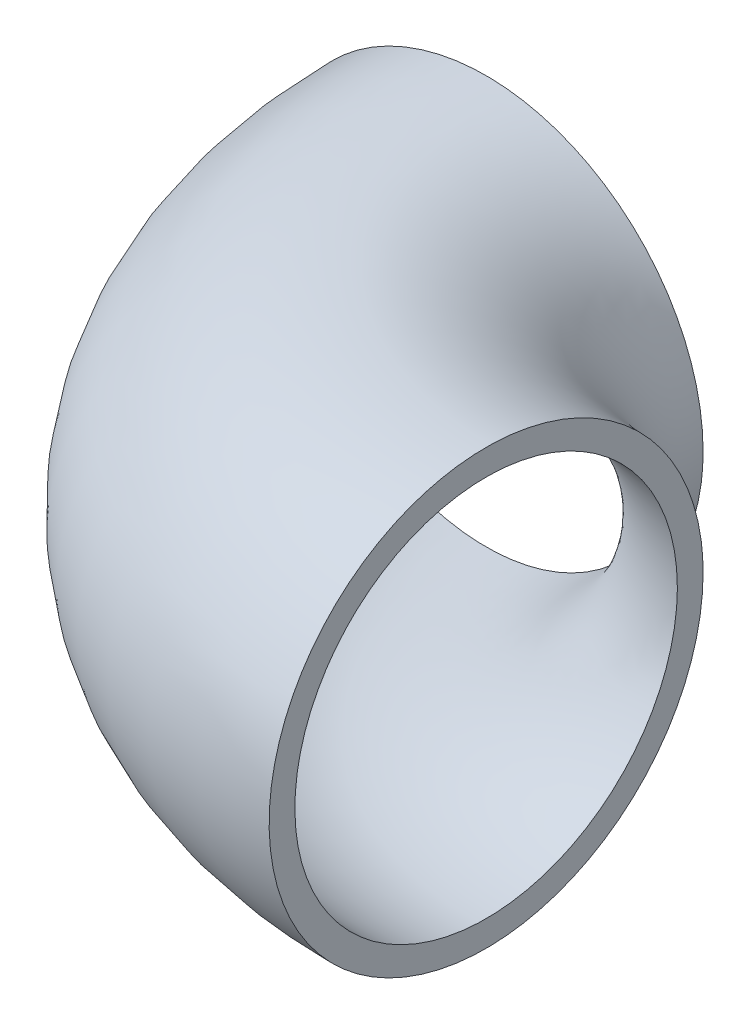
ISO-10303-21;
HEADER;
FILE_DESCRIPTION(('STEP AP214'),'2;1');
FILE_NAME('part.step','',(''),(''),'','','');
FILE_SCHEMA(('AUTOMOTIVE_DESIGN { 1 0 10303 214 1 1 1 1 }'));
ENDSEC;
DATA;
#1=APPLICATION_CONTEXT('core data for automotive mechanical design processes');
#2=APPLICATION_PROTOCOL_DEFINITION('international standard','automotive_design',2000,#1);
#3=PRODUCT_CONTEXT('',#1,'mechanical');
#4=PRODUCT('Part','Part','',(#3));
#5=PRODUCT_RELATED_PRODUCT_CATEGORY('part','',(#4));
#6=PRODUCT_DEFINITION_FORMATION('','',#4);
#7=PRODUCT_DEFINITION_CONTEXT('part definition',#1,'design');
#8=PRODUCT_DEFINITION('design','',#6,#7);
#9=PRODUCT_DEFINITION_SHAPE('','',#8);
#10=(LENGTH_UNIT() NAMED_UNIT(*) SI_UNIT(.MILLI.,.METRE.));
#11=(NAMED_UNIT(*) PLANE_ANGLE_UNIT() SI_UNIT($,.RADIAN.));
#12=(NAMED_UNIT(*) SI_UNIT($,.STERADIAN.) SOLID_ANGLE_UNIT());
#13=UNCERTAINTY_MEASURE_WITH_UNIT(LENGTH_MEASURE(1.E-05),#10,'distance_accuracy_value','');
#14=(GEOMETRIC_REPRESENTATION_CONTEXT(3) GLOBAL_UNCERTAINTY_ASSIGNED_CONTEXT((#13)) GLOBAL_UNIT_ASSIGNED_CONTEXT((#10,
#11,#12)) REPRESENTATION_CONTEXT('',''));
#15=CARTESIAN_POINT('',(0.,0.,0.));
#16=DIRECTION('',(0.,0.,1.));
#17=DIRECTION('',(1.,0.,0.));
#18=AXIS2_PLACEMENT_3D('',#15,#16,#17);
#19=CARTESIAN_POINT('',(25.,0.,0.));
#20=DIRECTION('',(0.,1.,0.));
#21=DIRECTION('',(0.,0.,1.));
#22=AXIS2_PLACEMENT_3D('',#19,#20,#21);
#23=TOROIDAL_SURFACE('',#22,25.,14.85);
#24=CARTESIAN_POINT('',(14.85,0.,0.));
#25=CARTESIAN_POINT('',(14.850001714907,0.431269539818421,0.));
#26=CARTESIAN_POINT('',(14.8312029198617,0.862508386844472,0.));
#27=CARTESIAN_POINT('',(14.7561419083545,1.72187278064136,0.));
#28=CARTESIAN_POINT('',(14.699867379948,2.14999725750052,0.));
#29=CARTESIAN_POINT('',(14.5501754615105,3.00024488137807,0.));
#30=CARTESIAN_POINT('',(14.4567121285373,3.42235993374621,0.));
#31=CARTESIAN_POINT('',(14.2333647740498,4.25679935147896,0.));
#32=CARTESIAN_POINT('',(14.1034846269427,4.6691247533115,0.));
#33=CARTESIAN_POINT('',(13.8131824181447,5.46743800677382,0.));
#34=CARTESIAN_POINT('',(13.653913858869,5.85384587692359,0.));
#35=CARTESIAN_POINT('',(13.3033846401699,6.61186941076837,0.));
#36=CARTESIAN_POINT('',(13.1121241655446,6.98348515989321,0.));
#37=CARTESIAN_POINT('',(12.6990512494461,7.70913964713766,0.));
#38=CARTESIAN_POINT('',(12.4772505465627,8.06318506788374,0.));
#39=CARTESIAN_POINT('',(12.0046169915072,8.75133728181143,0.));
#40=CARTESIAN_POINT('',(11.7537840969339,9.08544404587172,0.));
#41=CARTESIAN_POINT('',(11.2248268213982,9.73139522825799,0.));
#42=CARTESIAN_POINT('',(10.9466980886489,10.0432360829851,0.));
#43=CARTESIAN_POINT('',(10.3651599588744,10.642379850852,0.));
#44=CARTESIAN_POINT('',(10.0617505677214,10.9296827696914,0.));
#45=CARTESIAN_POINT('',(9.4317874638523,11.47772616156,0.));
#46=CARTESIAN_POINT('',(9.10523224702504,11.7384649056511,0.));
#47=CARTESIAN_POINT('',(8.4313167168582,12.2315048573112,0.));
#48=CARTESIAN_POINT('',(8.08395640117959,12.4638060616831,0.));
#49=CARTESIAN_POINT('',(7.37091106779882,12.8983127677142,0.));
#50=CARTESIAN_POINT('',(7.00522659875846,13.1005191697533,0.));
#51=CARTESIAN_POINT('',(6.25812321002622,13.4734069957536,0.));
#52=CARTESIAN_POINT('',(5.8767042913276,13.6440884217051,0.));
#53=CARTESIAN_POINT('',(5.10084566147467,13.952712063745,0.));
#54=CARTESIAN_POINT('',(4.70640601747304,14.0906544486507,0.));
#55=CARTESIAN_POINT('',(3.90730827729008,14.3328204629112,0.));
#56=CARTESIAN_POINT('',(3.50265018095997,14.437044091775,0.));
#57=CARTESIAN_POINT('',(2.68599092963392,14.6110319409723,0.));
#58=CARTESIAN_POINT('',(2.27398974815801,14.6807960370149,0.));
#59=CARTESIAN_POINT('',(1.44557483598964,14.7853682757075,0.));
#60=CARTESIAN_POINT('',(1.02916110530507,14.8201764184198,0.));
#61=CARTESIAN_POINT('',(0.194882405444454,14.8545892501376,0.));
#62=CARTESIAN_POINT('',(-0.222982560763608,14.8541940110964,0.));
#63=CARTESIAN_POINT('',(-1.05719381517876,14.8182030684534,0.));
#64=CARTESIAN_POINT('',(-1.47354010338808,14.7826073649033,0.));
#65=CARTESIAN_POINT('',(-2.30175416807366,14.6764685398814,0.));
#66=CARTESIAN_POINT('',(-2.71362194311915,14.6059254072452,0.));
#67=CARTESIAN_POINT('',(-3.52995071772898,14.4303932373198,0.));
#68=CARTESIAN_POINT('',(-3.93441171728089,14.3254041999728,0.));
#69=CARTESIAN_POINT('',(-4.73305203072097,14.0817264572596,0.));
#70=CARTESIAN_POINT('',(-5.12723133015994,13.9430377045368,0.));
#71=CARTESIAN_POINT('',(-5.90250527030376,13.6329466029071,0.));
#72=CARTESIAN_POINT('',(-6.28359991099967,13.4615442539777,0.));
#73=CARTESIAN_POINT('',(-7.02999501797992,13.0872446085495,0.));
#74=CARTESIAN_POINT('',(-7.39529549090904,12.8843473253011,0.));
#75=CARTESIAN_POINT('',(-8.10750536356425,12.4485002380215,0.));
#76=CARTESIAN_POINT('',(-8.45441476330818,12.2155504340194,0.));
#77=CARTESIAN_POINT('',(-9.1273759805104,11.7212545791936,0.));
#78=CARTESIAN_POINT('',(-9.4534278097352,11.4599085443894,0.));
#79=CARTESIAN_POINT('',(-10.08235606761,10.9106781331579,0.));
#80=CARTESIAN_POINT('',(-10.3852324962642,10.6227937567353,0.));
#81=CARTESIAN_POINT('',(-10.9656567391768,10.0225332897401,0.));
#82=CARTESIAN_POINT('',(-11.2432045486483,9.71015719453892,0.));
#83=CARTESIAN_POINT('',(-11.7709982905325,9.06313414387696,0.));
#84=CARTESIAN_POINT('',(-12.0212442229354,8.72848718840826,0.));
#85=CARTESIAN_POINT('',(-12.4926551562449,8.03930149189843,0.));
#86=CARTESIAN_POINT('',(-12.7138201517318,7.68476274715017,0.));
#87=CARTESIAN_POINT('',(-13.1254968054843,6.95831408746792,0.));
#88=CARTESIAN_POINT('',(-13.3160084637484,6.58640417253308,0.));
#89=CARTESIAN_POINT('',(-13.6650240082436,5.82785725315448,0.));
#90=CARTESIAN_POINT('',(-13.8235278964566,5.44122024962268,0.));
#91=CARTESIAN_POINT('',(-14.1074010478681,4.65596788901686,0.));
#92=CARTESIAN_POINT('',(-14.2327703110702,4.25735253194417,0.));
#93=CARTESIAN_POINT('',(-14.4494829052895,3.45097740602722,0.));
#94=CARTESIAN_POINT('',(-14.5408262384362,3.04321763775527,0.));
#95=CARTESIAN_POINT('',(-14.6888375872656,2.22145259279674,0.));
#96=CARTESIAN_POINT('',(-14.7455056029493,1.80744731611037,0.));
#97=CARTESIAN_POINT('',(-14.823763441425,0.976134581626911,0.));
#98=CARTESIAN_POINT('',(-14.8453532640505,0.558827123814162,0.));
#99=CARTESIAN_POINT('',(-14.8533012251979,-0.276123165147689,0.));
#100=CARTESIAN_POINT('',(-14.8396593637185,-0.693765996296804,0.));
#101=CARTESIAN_POINT('',(-14.7772409404471,-1.52641786390843,0.));
#102=CARTESIAN_POINT('',(-14.7284643767895,-1.94142690023109,0.));
#103=CARTESIAN_POINT('',(-14.5961233192446,-2.7658606900492,0.));
#104=CARTESIAN_POINT('',(-14.5125588253543,-3.17528544354416,0.));
#105=CARTESIAN_POINT('',(-14.3112359962527,-3.98563992137186,0.));
#106=CARTESIAN_POINT('',(-14.1934776594781,-4.38656964531621,0.));
#107=CARTESIAN_POINT('',(-13.9246043374229,-5.17708367418226,0.));
#108=CARTESIAN_POINT('',(-13.7734893521437,-5.56666797910442,0.));
#109=CARTESIAN_POINT('',(-13.4389770944449,-6.33172140321491,0.));
#110=CARTESIAN_POINT('',(-13.2555798266896,-6.70719052444271,0.));
#111=CARTESIAN_POINT('',(-12.8578068337259,-7.4413442803925,0.));
#112=CARTESIAN_POINT('',(-12.643431108526,-7.80002891511911,0.));
#113=CARTESIAN_POINT('',(-12.1852253177838,-8.4980636132802,0.));
#114=CARTESIAN_POINT('',(-11.941395256659,-8.83741367961445,0.));
#115=CARTESIAN_POINT('',(-11.426014253394,-9.49436672463122,0.));
#116=CARTESIAN_POINT('',(-11.1544633112504,-9.81196970331095,0.));
#117=CARTESIAN_POINT('',(-10.5855709830617,-10.4231707430052,0.));
#118=CARTESIAN_POINT('',(-10.2882295855584,-10.7167687933545,0.));
#119=CARTESIAN_POINT('',(-9.66987037016344,-11.2778725121412,0.));
#120=CARTESIAN_POINT('',(-9.34885255225288,-11.5453781805576,0.));
#121=CARTESIAN_POINT('',(-8.68542262355681,-12.0523954195763,0.));
#122=CARTESIAN_POINT('',(-8.34301050516708,-12.2919069802285,0.));
#123=CARTESIAN_POINT('',(-7.63922642622146,-12.741233107842,0.));
#124=CARTESIAN_POINT('',(-7.27785446567621,-12.9510476748199,0.));
#125=CARTESIAN_POINT('',(-6.53872027068513,-13.3394879331616,0.));
#126=CARTESIAN_POINT('',(-6.16095805516813,-13.5181136605437,0.));
#127=CARTESIAN_POINT('',(-5.39172862121754,-13.8429066157044,0.));
#128=CARTESIAN_POINT('',(-5.00026140280374,-13.9890738435298,0.));
#129=CARTESIAN_POINT('',(-4.20640521532091,-14.2479105879337,0.));
#130=CARTESIAN_POINT('',(-3.8040162506088,-14.3605801178749,0.));
#131=CARTESIAN_POINT('',(-2.99117715924062,-14.5516205338005,0.));
#132=CARTESIAN_POINT('',(-2.58072703257368,-14.6299914197385,0.));
#133=CARTESIAN_POINT('',(-1.75468285904574,-14.7518774975318,0.));
#134=CARTESIAN_POINT('',(-1.33908880214015,-14.7953926213131,0.));
#135=CARTESIAN_POINT('',(-0.505712185859261,-14.8472575522911,0.));
#136=CARTESIAN_POINT('',(-0.0879296264835476,-14.8556073594809,0.));
#137=CARTESIAN_POINT('',(0.746852908627997,-14.8370823150543,0.));
#138=CARTESIAN_POINT('',(1.16385288604144,-14.810207539035,0.));
#139=CARTESIAN_POINT('',(1.99410654449481,-14.7214245227914,0.));
#140=CARTESIAN_POINT('',(2.40736022552939,-14.6595162825172,0.));
#141=CARTESIAN_POINT('',(3.22718427473851,-14.5011062807016,0.));
#142=CARTESIAN_POINT('',(3.63375462722956,-14.4046044379928,0.));
#143=CARTESIAN_POINT('',(4.43732053615589,-14.1776933301535,0.));
#144=CARTESIAN_POINT('',(4.83431609278522,-14.0472840657101,0.));
#145=CARTESIAN_POINT('',(5.61591805900923,-13.7534822217998,0.));
#146=CARTESIAN_POINT('',(6.00052421358857,-13.5900889639144,0.));
#147=CARTESIAN_POINT('',(6.75460446488679,-13.2314824366493,0.));
#148=CARTESIAN_POINT('',(7.1240785583495,-13.0362691604226,0.));
#149=CARTESIAN_POINT('',(7.84525214014591,-12.6154196424498,0.));
#150=CARTESIAN_POINT('',(8.19695239606327,-12.3897847160441,0.));
#151=CARTESIAN_POINT('',(8.88009480292817,-11.9096897425408,0.));
#152=CARTESIAN_POINT('',(9.2115369763951,-11.6552297274868,0.));
#153=CARTESIAN_POINT('',(9.85176980694618,-11.1193248123195,0.));
#154=CARTESIAN_POINT('',(10.1605631158983,-10.8378830803223,0.));
#155=CARTESIAN_POINT('',(10.7533476385572,-10.2499887173408,0.));
#156=CARTESIAN_POINT('',(11.0373387461935,-9.94353597940391,0.));
#157=CARTESIAN_POINT('',(11.5785751955136,-9.3077090866942,0.));
#158=CARTESIAN_POINT('',(11.8358129840982,-8.97832850242136,0.));
#159=CARTESIAN_POINT('',(12.3216178270776,-8.29907108788987,0.));
#160=CARTESIAN_POINT('',(12.5501853751177,-7.94919461068251,0.));
#161=CARTESIAN_POINT('',(12.9771437215815,-7.23123585873967,0.));
#162=CARTESIAN_POINT('',(13.1755183330822,-6.86314395756267,0.));
#163=CARTESIAN_POINT('',(13.5405323720471,-6.1115481282243,0.));
#164=CARTESIAN_POINT('',(13.7071717187763,-5.72804416085739,0.));
#165=CARTESIAN_POINT('',(14.0073506660861,-4.9488116147202,0.));
#166=CARTESIAN_POINT('',(14.1409293033389,-4.55309807970503,0.));
#167=CARTESIAN_POINT('',(14.374258863906,-3.75196325559508,0.));
#168=CARTESIAN_POINT('',(14.4740194578614,-3.34654477729932,0.));
#169=CARTESIAN_POINT('',(14.654025938658,-2.45454711502314,0.));
#170=CARTESIAN_POINT('',(14.7274561201995,-1.96657780677684,0.));
#171=CARTESIAN_POINT('',(14.8254439569237,-0.985725875785203,0.));
#172=CARTESIAN_POINT('',(14.8499980402517,-0.492842896594968,0.));
#173=CARTESIAN_POINT('',(14.85,0.,0.));
#174=B_SPLINE_CURVE_WITH_KNOTS('',3,(#24,#25,#26,#27,#28,#29,#30,#31,#32,#33,#34,#35,#36,#37,
#38,#39,#40,#41,#42,#43,#44,#45,#46,#47,#48,#49,#50,#51,#52,#53,#54,#55,#56,#57,#58,#59,#60,#61,
#62,#63,#64,#65,#66,#67,#68,#69,#70,#71,#72,#73,#74,#75,#76,#77,#78,#79,#80,#81,#82,#83,#84,#85,
#86,#87,#88,#89,#90,#91,#92,#93,#94,#95,#96,#97,#98,#99,#100,#101,#102,#103,#104,#105,#106,#107,
#108,#109,#110,#111,#112,#113,#114,#115,#116,#117,#118,#119,#120,#121,#122,#123,#124,#125,#126,
#127,#128,#129,#130,#131,#132,#133,#134,#135,#136,#137,#138,#139,#140,#141,#142,#143,#144,#145,
#146,#147,#148,#149,#150,#151,#152,#153,#154,#155,#156,#157,#158,#159,#160,#161,#162,#163,#164,
#165,#166,#167,#168,#169,#170,#171,#172,#173),.UNSPECIFIED.,.T.,.F.,(4,2,2,2,2,2,2,2,2,2,2,2,2,
2,2,2,2,2,2,2,2,2,2,2,2,2,2,2,2,2,2,2,2,2,2,2,2,2,2,2,2,2,2,2,2,2,2,2,2,2,2,2,2,2,2,2,2,2,2,2,2,
2,2,2,2,2,2,2,2,2,2,2,2,2,4),(0.,1.29334687578684,2.58711886602938,3.88249416579668,
5.17773170205054,6.43008803856843,7.68243714122718,8.9343062216955,10.1861771305316,
11.4382479509052,12.6903184804467,13.9424704494225,15.1946225591737,16.4467371993628,
17.6988517605098,18.9509598650493,20.2030679878204,21.4551806267435,22.7072932634271,
23.9594033408685,25.2115134164671,26.4636238920725,27.7157343697786,28.9678466070191,
30.2199588451139,31.4720705564261,32.7241822665244,33.9762932702547,35.2284042737607,
36.4805155138977,37.7326267544799,38.9847382284125,40.2368497024074,41.4889610988661,
42.7410724951847,43.9931838131397,45.2452951310542,46.49740645491,47.7495177788123,
49.0016291692026,50.253740559701,51.5058520074449,52.7579634551378,54.0100747219151,
55.2621859883477,56.5142970669905,57.7664081457943,59.0185197808936,60.2706314169945,
61.522743498138,62.7748555785781,64.0269662130136,65.2790768456412,66.5311869787827,
67.7832971136124,69.0354096938302,70.287522274288,71.5396321675295,72.7917420625535,
74.0438548954322,75.2959677029347,76.5481062666611,77.8002450998252,79.0523298116394,
80.3044131315794,81.5563496151181,82.8082914524921,84.0605857888233,85.3128585601416,
86.5658003481469,87.8187453236148,89.0702037405783,90.321303986774,91.7991970085339,
93.2771980304313),.UNSPECIFIED.);
#175=CARTESIAN_POINT('',(14.85,0.,0.));
#176=VERTEX_POINT('',#175);
#177=EDGE_CURVE('E31',#176,#176,#174,.T.);
#178=ORIENTED_EDGE('',*,*,#177,.F.);
#179=EDGE_LOOP('',(#178));
#180=FACE_BOUND('',#179,.T.);
#181=CARTESIAN_POINT('',(25.,0.,10.15));
#182=CARTESIAN_POINT('',(25.,0.43126953981842,10.149998285093));
#183=CARTESIAN_POINT('',(25.,0.862508386844472,10.1687970801383));
#184=CARTESIAN_POINT('',(25.,1.72187278064136,10.2438580916455));
#185=CARTESIAN_POINT('',(25.,2.14999725750052,10.300132620052));
#186=CARTESIAN_POINT('',(25.,3.00024488137807,10.4498245384895));
#187=CARTESIAN_POINT('',(25.,3.42235993374621,10.5432878714627));
#188=CARTESIAN_POINT('',(25.,4.25679935147896,10.7666352259502));
#189=CARTESIAN_POINT('',(25.,4.6691247533115,10.8965153730573));
#190=CARTESIAN_POINT('',(25.,5.46743800677382,11.1868175818553));
#191=CARTESIAN_POINT('',(25.,5.85384587692359,11.346086141131));
#192=CARTESIAN_POINT('',(25.,6.61186941076837,11.6966153598301));
#193=CARTESIAN_POINT('',(25.,6.98348515989321,11.8878758344554));
#194=CARTESIAN_POINT('',(25.,7.70913964713766,12.3009487505539));
#195=CARTESIAN_POINT('',(25.,8.06318506788374,12.5227494534373));
#196=CARTESIAN_POINT('',(25.,8.75133728181143,12.9953830084928));
#197=CARTESIAN_POINT('',(25.,9.08544404587172,13.2462159030661));
#198=CARTESIAN_POINT('',(25.,9.73139522825799,13.7751731786018));
#199=CARTESIAN_POINT('',(25.,10.0432360829851,14.0533019113511));
#200=CARTESIAN_POINT('',(25.,10.642379850852,14.6348400411256));
#201=CARTESIAN_POINT('',(25.,10.9296827696914,14.9382494322786));
#202=CARTESIAN_POINT('',(25.,11.47772616156,15.5682125361477));
#203=CARTESIAN_POINT('',(25.,11.7384649056511,15.894767752975));
#204=CARTESIAN_POINT('',(25.,12.2315048573112,16.5686832831418));
#205=CARTESIAN_POINT('',(25.,12.4638060616831,16.9160435988204));
#206=CARTESIAN_POINT('',(25.,12.8983127677142,17.6290889322012));
#207=CARTESIAN_POINT('',(25.,13.1005191697533,17.9947734012415));
#208=CARTESIAN_POINT('',(25.,13.4734069957536,18.7418767899738));
#209=CARTESIAN_POINT('',(25.,13.6440884217051,19.1232957086724));
#210=CARTESIAN_POINT('',(25.,13.952712063745,19.8991543385253));
#211=CARTESIAN_POINT('',(25.,14.0906544486507,20.293593982527));
#212=CARTESIAN_POINT('',(25.,14.3328204629112,21.0926917227099));
#213=CARTESIAN_POINT('',(25.,14.437044091775,21.49734981904));
#214=CARTESIAN_POINT('',(25.,14.6110319409723,22.3140090703661));
#215=CARTESIAN_POINT('',(25.,14.6807960370149,22.726010251842));
#216=CARTESIAN_POINT('',(25.,14.7853682757075,23.5544251640104));
#217=CARTESIAN_POINT('',(25.,14.8201764184198,23.9708388946949));
#218=CARTESIAN_POINT('',(25.,14.8545892501376,24.8051175945555));
#219=CARTESIAN_POINT('',(25.,14.8541940110964,25.2229825607636));
#220=CARTESIAN_POINT('',(25.,14.8182030684534,26.0571938151788));
#221=CARTESIAN_POINT('',(25.,14.7826073649033,26.4735401033881));
#222=CARTESIAN_POINT('',(25.,14.6764685398814,27.3017541680737));
#223=CARTESIAN_POINT('',(25.,14.6059254072452,27.7136219431191));
#224=CARTESIAN_POINT('',(25.,14.4303932373198,28.529950717729));
#225=CARTESIAN_POINT('',(25.,14.3254041999728,28.9344117172809));
#226=CARTESIAN_POINT('',(25.,14.0817264572596,29.733052030721));
#227=CARTESIAN_POINT('',(25.,13.9430377045368,30.1272313301599));
#228=CARTESIAN_POINT('',(25.,13.6329466029071,30.9025052703038));
#229=CARTESIAN_POINT('',(25.,13.4615442539777,31.2835999109997));
#230=CARTESIAN_POINT('',(25.,13.0872446085495,32.0299950179799));
#231=CARTESIAN_POINT('',(25.,12.8843473253011,32.395295490909));
#232=CARTESIAN_POINT('',(25.,12.4485002380215,33.1075053635643));
#233=CARTESIAN_POINT('',(25.,12.2155504340194,33.4544147633082));
#234=CARTESIAN_POINT('',(25.,11.7212545791936,34.1273759805104));
#235=CARTESIAN_POINT('',(25.,11.4599085443894,34.4534278097352));
#236=CARTESIAN_POINT('',(25.,10.9106781331579,35.08235606761));
#237=CARTESIAN_POINT('',(25.,10.6227937567353,35.3852324962642));
#238=CARTESIAN_POINT('',(25.,10.0225332897401,35.9656567391768));
#239=CARTESIAN_POINT('',(25.,9.71015719453893,36.2432045486483));
#240=CARTESIAN_POINT('',(25.,9.06313414387696,36.7709982905325));
#241=CARTESIAN_POINT('',(25.,8.72848718840827,37.0212442229354));
#242=CARTESIAN_POINT('',(25.,8.03930149189844,37.4926551562449));
#243=CARTESIAN_POINT('',(25.,7.68476274715017,37.7138201517318));
#244=CARTESIAN_POINT('',(25.,6.95831408746792,38.1254968054843));
#245=CARTESIAN_POINT('',(25.,6.58640417253308,38.3160084637484));
#246=CARTESIAN_POINT('',(25.,5.82785725315448,38.6650240082436));
#247=CARTESIAN_POINT('',(25.,5.44122024962269,38.8235278964566));
#248=CARTESIAN_POINT('',(25.,4.65596788901687,39.1074010478681));
#249=CARTESIAN_POINT('',(25.,4.25735253194417,39.2327703110702));
#250=CARTESIAN_POINT('',(25.,3.45097740602723,39.4494829052895));
#251=CARTESIAN_POINT('',(25.,3.04321763775528,39.5408262384362));
#252=CARTESIAN_POINT('',(25.,2.22145259279675,39.6888375872656));
#253=CARTESIAN_POINT('',(25.,1.80744731611038,39.7455056029493));
#254=CARTESIAN_POINT('',(25.,0.976134581626924,39.823763441425));
#255=CARTESIAN_POINT('',(25.,0.558827123814176,39.8453532640505));
#256=CARTESIAN_POINT('',(25.,-0.276123165147676,39.8533012251979));
#257=CARTESIAN_POINT('',(25.,-0.69376599629679,39.8396593637185));
#258=CARTESIAN_POINT('',(25.,-1.52641786390842,39.7772409404471));
#259=CARTESIAN_POINT('',(25.,-1.94142690023108,39.7284643767895));
#260=CARTESIAN_POINT('',(25.,-2.76586069004918,39.5961233192446));
#261=CARTESIAN_POINT('',(25.,-3.17528544354415,39.5125588253543));
#262=CARTESIAN_POINT('',(25.,-3.98563992137185,39.3112359962527));
#263=CARTESIAN_POINT('',(25.,-4.3865696453162,39.1934776594781));
#264=CARTESIAN_POINT('',(25.,-5.17708367418225,38.9246043374229));
#265=CARTESIAN_POINT('',(25.,-5.56666797910441,38.7734893521437));
#266=CARTESIAN_POINT('',(25.,-6.3317214032149,38.4389770944449));
#267=CARTESIAN_POINT('',(25.,-6.7071905244427,38.2555798266896));
#268=CARTESIAN_POINT('',(25.,-7.44134428039249,37.8578068337259));
#269=CARTESIAN_POINT('',(25.,-7.8000289151191,37.643431108526));
#270=CARTESIAN_POINT('',(25.,-8.4980636132802,37.1852253177838));
#271=CARTESIAN_POINT('',(25.,-8.83741367961444,36.941395256659));
#272=CARTESIAN_POINT('',(25.,-9.49436672463121,36.426014253394));
#273=CARTESIAN_POINT('',(25.,-9.81196970331094,36.1544633112504));
#274=CARTESIAN_POINT('',(25.,-10.4231707430051,35.5855709830617));
#275=CARTESIAN_POINT('',(25.,-10.7167687933545,35.2882295855584));
#276=CARTESIAN_POINT('',(25.,-11.2778725121412,34.6698703701634));
#277=CARTESIAN_POINT('',(25.,-11.5453781805576,34.3488525522529));
#278=CARTESIAN_POINT('',(25.,-12.0523954195763,33.6854226235568));
#279=CARTESIAN_POINT('',(25.,-12.2919069802285,33.3430105051671));
#280=CARTESIAN_POINT('',(25.,-12.7412331078419,32.6392264262215));
#281=CARTESIAN_POINT('',(25.,-12.9510476748199,32.2778544656762));
#282=CARTESIAN_POINT('',(25.,-13.3394879331616,31.5387202706851));
#283=CARTESIAN_POINT('',(25.,-13.5181136605437,31.1609580551681));
#284=CARTESIAN_POINT('',(25.,-13.8429066157044,30.3917286212175));
#285=CARTESIAN_POINT('',(25.,-13.9890738435298,30.0002614028037));
#286=CARTESIAN_POINT('',(25.,-14.2479105879337,29.2064052153209));
#287=CARTESIAN_POINT('',(25.,-14.3605801178749,28.8040162506088));
#288=CARTESIAN_POINT('',(25.,-14.5516205338005,27.9911771592406));
#289=CARTESIAN_POINT('',(25.,-14.6299914197385,27.5807270325737));
#290=CARTESIAN_POINT('',(25.,-14.7518774975318,26.7546828590457));
#291=CARTESIAN_POINT('',(25.,-14.7953926213131,26.3390888021402));
#292=CARTESIAN_POINT('',(25.,-14.8472575522911,25.5057121858593));
#293=CARTESIAN_POINT('',(25.,-14.8556073594809,25.0879296264836));
#294=CARTESIAN_POINT('',(25.,-14.8370823150543,24.253147091372));
#295=CARTESIAN_POINT('',(25.,-14.810207539035,23.8361471139586));
#296=CARTESIAN_POINT('',(25.,-14.7214245227914,23.0058934555052));
#297=CARTESIAN_POINT('',(25.,-14.6595162825172,22.5926397744706));
#298=CARTESIAN_POINT('',(25.,-14.5011062807016,21.7728157252615));
#299=CARTESIAN_POINT('',(25.,-14.4046044379928,21.3662453727705));
#300=CARTESIAN_POINT('',(25.,-14.1776933301535,20.5626794638441));
#301=CARTESIAN_POINT('',(25.,-14.0472840657101,20.1656839072148));
#302=CARTESIAN_POINT('',(25.,-13.7534822217998,19.3840819409908));
#303=CARTESIAN_POINT('',(25.,-13.5900889639144,18.9994757864114));
#304=CARTESIAN_POINT('',(25.,-13.2314824366493,18.2453955351132));
#305=CARTESIAN_POINT('',(25.,-13.0362691604226,17.8759214416505));
#306=CARTESIAN_POINT('',(25.,-12.6154196424498,17.1547478598541));
#307=CARTESIAN_POINT('',(25.,-12.3897847160441,16.8030476039367));
#308=CARTESIAN_POINT('',(25.,-11.9096897425408,16.1199051970718));
#309=CARTESIAN_POINT('',(25.,-11.6552297274868,15.7884630236049));
#310=CARTESIAN_POINT('',(25.,-11.1193248123195,15.1482301930538));
#311=CARTESIAN_POINT('',(25.,-10.8378830803223,14.8394368841017));
#312=CARTESIAN_POINT('',(25.,-10.2499887173408,14.2466523614428));
#313=CARTESIAN_POINT('',(25.,-9.94353597940391,13.9626612538065));
#314=CARTESIAN_POINT('',(25.,-9.3077090866942,13.4214248044864));
#315=CARTESIAN_POINT('',(25.,-8.97832850242137,13.1641870159018));
#316=CARTESIAN_POINT('',(25.,-8.29907108788987,12.6783821729224));
#317=CARTESIAN_POINT('',(25.,-7.94919461068251,12.4498146248823));
#318=CARTESIAN_POINT('',(25.,-7.23123585873967,12.0228562784185));
#319=CARTESIAN_POINT('',(25.,-6.86314395756267,11.8244816669178));
#320=CARTESIAN_POINT('',(25.,-6.1115481282243,11.4594676279529));
#321=CARTESIAN_POINT('',(25.,-5.72804416085739,11.2928282812237));
#322=CARTESIAN_POINT('',(25.,-4.94881161472021,10.9926493339139));
#323=CARTESIAN_POINT('',(25.,-4.55309807970504,10.8590706966611));
#324=CARTESIAN_POINT('',(25.,-3.75196325559508,10.625741136094));
#325=CARTESIAN_POINT('',(25.,-3.34654477729933,10.5259805421386));
#326=CARTESIAN_POINT('',(25.,-2.45454711502315,10.345974061342));
#327=CARTESIAN_POINT('',(25.,-1.96657780677685,10.2725438798005));
#328=CARTESIAN_POINT('',(25.,-0.985725875785205,10.1745560430763));
#329=CARTESIAN_POINT('',(25.,-0.492842896594969,10.1500019597483));
#330=CARTESIAN_POINT('',(25.,0.,10.15));
#331=B_SPLINE_CURVE_WITH_KNOTS('',3,(#181,#182,#183,#184,#185,#186,#187,#188,#189,#190,#191,
#192,#193,#194,#195,#196,#197,#198,#199,#200,#201,#202,#203,#204,#205,#206,#207,#208,#209,#210,
#211,#212,#213,#214,#215,#216,#217,#218,#219,#220,#221,#222,#223,#224,#225,#226,#227,#228,#229,
#230,#231,#232,#233,#234,#235,#236,#237,#238,#239,#240,#241,#242,#243,#244,#245,#246,#247,#248,
#249,#250,#251,#252,#253,#254,#255,#256,#257,#258,#259,#260,#261,#262,#263,#264,#265,#266,#267,
#268,#269,#270,#271,#272,#273,#274,#275,#276,#277,#278,#279,#280,#281,#282,#283,#284,#285,#286,
#287,#288,#289,#290,#291,#292,#293,#294,#295,#296,#297,#298,#299,#300,#301,#302,#303,#304,#305,
#306,#307,#308,#309,#310,#311,#312,#313,#314,#315,#316,#317,#318,#319,#320,#321,#322,#323,#324,
#325,#326,#327,#328,#329,#330),.UNSPECIFIED.,.T.,.F.,(4,2,2,2,2,2,2,2,2,2,2,2,2,2,2,2,2,2,2,2,2,
2,2,2,2,2,2,2,2,2,2,2,2,2,2,2,2,2,2,2,2,2,2,2,2,2,2,2,2,2,2,2,2,2,2,2,2,2,2,2,2,2,2,2,2,2,2,2,2,
2,2,2,2,2,4),(0.,1.29334687578684,2.58711886602938,3.88249416579668,5.17773170205054,
6.43008803856843,7.68243714122718,8.9343062216955,10.1861771305316,11.4382479509052,
12.6903184804467,13.9424704494225,15.1946225591737,16.4467371993628,17.6988517605098,
18.9509598650493,20.2030679878204,21.4551806267435,22.7072932634271,23.9594033408685,
25.2115134164671,26.4636238920725,27.7157343697786,28.9678466070191,30.2199588451139,
31.4720705564261,32.7241822665244,33.9762932702547,35.2284042737607,36.4805155138977,
37.7326267544799,38.9847382284125,40.2368497024074,41.4889610988661,42.7410724951847,
43.9931838131397,45.2452951310542,46.49740645491,47.7495177788123,49.0016291692026,
50.253740559701,51.5058520074449,52.7579634551378,54.0100747219151,55.2621859883477,
56.5142970669905,57.7664081457943,59.0185197808936,60.2706314169945,61.522743498138,
62.7748555785781,64.0269662130136,65.2790768456412,66.5311869787827,67.7832971136124,
69.0354096938302,70.287522274288,71.5396321675295,72.7917420625535,74.0438548954322,
75.2959677029347,76.5481062666611,77.8002450998252,79.0523298116394,80.3044131315794,
81.5563496151181,82.8082914524921,84.0605857888233,85.3128585601416,86.5658003481469,
87.8187453236147,89.0702037405783,90.321303986774,91.7991970085338,93.2771980304313),.UNSPECIFIED.);
#332=CARTESIAN_POINT('',(25.,0.,10.15));
#333=VERTEX_POINT('',#332);
#334=EDGE_CURVE('E20',#333,#333,#331,.T.);
#335=ORIENTED_EDGE('',*,*,#334,.T.);
#336=EDGE_LOOP('',(#335));
#337=FACE_BOUND('',#336,.T.);
#338=ADVANCED_FACE('F15',(#180,#337),#23,.F.);
#339=CARTESIAN_POINT('',(25.,0.,25.));
#340=DIRECTION('',(-1.,0.,0.));
#341=DIRECTION('',(0.,0.,1.));
#342=AXIS2_PLACEMENT_3D('',#339,#340,#341);
#343=PLANE('',#342);
#344=ORIENTED_EDGE('',*,*,#334,.F.);
#345=EDGE_LOOP('',(#344));
#346=FACE_BOUND('',#345,.T.);
#347=CARTESIAN_POINT('',(25.,0.,8.15));
#348=CARTESIAN_POINT('',(25.,-0.473405971387197,8.14999647542441));
#349=CARTESIAN_POINT('',(25.,-0.946755742062747,8.16995848938801));
#350=CARTESIAN_POINT('',(25.,-1.89025286791761,8.24966953341522));
#351=CARTESIAN_POINT('',(25.,-2.36039934773651,8.30942903050888));
#352=CARTESIAN_POINT('',(25.,-3.29447038633499,8.46840293867187));
#353=CARTESIAN_POINT('',(25.,-3.75838770194599,8.56765975609713));
#354=CARTESIAN_POINT('',(25.,-4.67626223566817,8.80494867745198));
#355=CARTESIAN_POINT('',(25.,-5.1302194897766,8.94298064121713));
#356=CARTESIAN_POINT('',(25.,-5.80102659083708,9.17828142464854));
#357=CARTESIAN_POINT('',(25.,-6.02292629114337,9.26141730522723));
#358=CARTESIAN_POINT('',(25.,-6.46296791399947,9.43694622155027));
#359=CARTESIAN_POINT('',(25.,-6.68111078288907,9.52933688484429));
#360=CARTESIAN_POINT('',(25.,-7.32944673533434,9.82020999338008));
#361=CARTESIAN_POINT('',(25.,-7.75358245486883,10.0324059410491));
#362=CARTESIAN_POINT('',(25.,-8.58230595019979,10.4916928854008));
#363=CARTESIAN_POINT('',(25.,-8.98689868055011,10.7387749747419));
#364=CARTESIAN_POINT('',(25.,-9.77384752363146,11.266146853148));
#365=CARTESIAN_POINT('',(25.,-10.1562037233513,11.5464365122929));
#366=CARTESIAN_POINT('',(25.,-10.8959833656631,12.1382557985627));
#367=CARTESIAN_POINT('',(25.,-11.2534041541578,12.4497887426118));
#368=CARTESIAN_POINT('',(25.,-11.9407329474916,13.1018574455283));
#369=CARTESIAN_POINT('',(25.,-12.2706409244486,13.4423932337869));
#370=CARTESIAN_POINT('',(25.,-12.9006092146307,14.1500596796545));
#371=CARTESIAN_POINT('',(25.,-13.2006683656221,14.5171913718759));
#372=CARTESIAN_POINT('',(25.,-13.768791395541,15.2754277936121));
#373=CARTESIAN_POINT('',(25.,-14.0368552807327,15.6665325184333));
#374=CARTESIAN_POINT('',(25.,-14.539077235897,16.469926936504));
#375=CARTESIAN_POINT('',(25.,-14.7732359353689,16.8822162362382));
#376=CARTESIAN_POINT('',(25.,-15.2059887461581,17.7250553670636));
#377=CARTESIAN_POINT('',(25.,-15.4045828568198,18.1556051984914));
#378=CARTESIAN_POINT('',(25.,-15.7647942232589,19.0319035355655));
#379=CARTESIAN_POINT('',(25.,-15.926411553841,19.4776520104626));
#380=CARTESIAN_POINT('',(25.,-16.2115208767296,20.3811794627807));
#381=CARTESIAN_POINT('',(25.,-16.3350128690801,20.8389584401879));
#382=CARTESIAN_POINT('',(25.,-16.5429937614896,21.7632932537249));
#383=CARTESIAN_POINT('',(25.,-16.6274825870337,22.229849106621));
#384=CARTESIAN_POINT('',(25.,-16.7568561319248,23.1684198823518));
#385=CARTESIAN_POINT('',(25.,-16.8017408512833,23.6404348051849));
#386=CARTESIAN_POINT('',(25.,-16.8515870349239,24.5865671171415));
#387=CARTESIAN_POINT('',(25.,-16.856548571242,25.0606845024698));
#388=CARTESIAN_POINT('',(25.,-16.8265133045482,26.007651901333));
#389=CARTESIAN_POINT('',(25.,-16.7915165015849,26.4805019148694));
#390=CARTESIAN_POINT('',(25.,-16.6818133416501,27.4215730723641));
#391=CARTESIAN_POINT('',(25.,-16.6071069698371,27.8897942145922));
#392=CARTESIAN_POINT('',(25.,-16.4185157799555,28.818278682178));
#393=CARTESIAN_POINT('',(25.,-16.3046309618352,29.278542007525));
#394=CARTESIAN_POINT('',(25.,-16.0384923904922,30.1878391286923));
#395=CARTESIAN_POINT('',(25.,-15.8862385967301,30.6368729126473));
#396=CARTESIAN_POINT('',(25.,-15.5444445680217,31.5205180820105));
#397=CARTESIAN_POINT('',(25.,-15.3549043330565,31.9551294674114));
#398=CARTESIAN_POINT('',(25.,-14.9398850086358,32.8068398708066));
#399=CARTESIAN_POINT('',(25.,-14.7144059308927,33.223938894508));
#400=CARTESIAN_POINT('',(25.,-14.2291118985885,34.0376593992335));
#401=CARTESIAN_POINT('',(25.,-13.9692969440525,34.4342808802724));
#402=CARTESIAN_POINT('',(25.,-13.4171783994417,35.2042264016007));
#403=CARTESIAN_POINT('',(25.,-13.1248748225269,35.5775504513268));
#404=CARTESIAN_POINT('',(25.,-12.5098570500397,36.2982471757682));
#405=CARTESIAN_POINT('',(25.,-12.1871428544709,36.6456198504865));
#406=CARTESIAN_POINT('',(25.,-11.513598102048,37.3119442600817));
#407=CARTESIAN_POINT('',(25.,-11.1627675413357,37.6308959910588));
#408=CARTESIAN_POINT('',(25.,-10.4354842918554,38.23811090426));
#409=CARTESIAN_POINT('',(25.,-10.0590316030809,38.5263740864765));
#410=CARTESIAN_POINT('',(25.,-9.28318039946254,39.0701625594264));
#411=CARTESIAN_POINT('',(25.,-8.88378188161799,39.3256878458786));
#412=CARTESIAN_POINT('',(25.,-8.06487854916863,39.8021838512071));
#413=CARTESIAN_POINT('',(25.,-7.64537373456309,40.0231545700823));
#414=CARTESIAN_POINT('',(25.,-6.78924025524545,40.4289704619286));
#415=CARTESIAN_POINT('',(25.,-6.35261159126745,40.6138156364486));
#416=CARTESIAN_POINT('',(25.,-5.46533456466945,40.9460663128771));
#417=CARTESIAN_POINT('',(25.,-5.01468620205054,41.0934718147886));
#418=CARTESIAN_POINT('',(25.,-4.10257363872907,41.3497951753852));
#419=CARTESIAN_POINT('',(25.,-3.64110943851407,41.4587130358053));
#420=CARTESIAN_POINT('',(25.,-2.7106459142359,41.6372867819795));
#421=CARTESIAN_POINT('',(25.,-2.24164659017292,41.7069426677346));
#422=CARTESIAN_POINT('',(25.,-1.2994471222383,41.8064972529886));
#423=CARTESIAN_POINT('',(25.,-0.826246978366659,41.8363959524874));
#424=CARTESIAN_POINT('',(25.,0.120989959835233,41.8562236034007));
#425=CARTESIAN_POINT('',(25.,0.595026754165505,41.8461525548142));
#426=CARTESIAN_POINT('',(25.,1.54056689717191,41.7861123073144));
#427=CARTESIAN_POINT('',(25.,2.01207024573383,41.7361431066025));
#428=CARTESIAN_POINT('',(25.,2.94919136920497,41.5966618036977));
#429=CARTESIAN_POINT('',(25.,3.41480914411372,41.5071497015017));
#430=CARTESIAN_POINT('',(25.,4.33684887647433,41.2892189683961));
#431=CARTESIAN_POINT('',(25.,4.79327083353195,41.1608003358184));
#432=CARTESIAN_POINT('',(25.,5.69367402253535,40.8659695229388));
#433=CARTESIAN_POINT('',(25.,6.13765525448156,40.6995573426382));
#434=CARTESIAN_POINT('',(25.,7.01002049520597,40.329922549572));
#435=CARTESIAN_POINT('',(25.,7.43840450602385,40.1266999416202));
#436=CARTESIAN_POINT('',(25.,8.2765298123403,39.6848890695261));
#437=CARTESIAN_POINT('',(25.,8.68627110784354,39.4463008053925));
#438=CARTESIAN_POINT('',(25.,9.48419791408995,38.9354548753781));
#439=CARTESIAN_POINT('',(25.,9.87238342779098,38.6631972141173));
#440=CARTESIAN_POINT('',(25.,10.6244389658671,38.0869480520834));
#441=CARTESIAN_POINT('',(25.,10.9883089902393,37.7829565513067));
#442=CARTESIAN_POINT('',(25.,11.6891467948885,37.1454007775181));
#443=CARTESIAN_POINT('',(25.,12.0261145642682,36.8118364925274));
#444=CARTESIAN_POINT('',(25.,12.6707520552942,36.1175066985791));
#445=CARTESIAN_POINT('',(25.,12.9784217769191,35.7567411896015));
#446=CARTESIAN_POINT('',(25.,13.5622759191638,35.0105736538042));
#447=CARTESIAN_POINT('',(25.,13.8384603295228,34.6251716189556));
#448=CARTESIAN_POINT('',(25.,14.3573802255986,33.8324711175957));
#449=CARTESIAN_POINT('',(25.,14.6001157113326,33.4251726510955));
#450=CARTESIAN_POINT('',(25.,15.0504118145302,32.5915753783284));
#451=CARTESIAN_POINT('',(25.,15.2579724691583,32.1652765921372));
#452=CARTESIAN_POINT('',(25.,15.6364435921372,31.2967090055212));
#453=CARTESIAN_POINT('',(25.,15.8073540605365,30.8544402051175));
#454=CARTESIAN_POINT('',(25.,16.1113096847157,29.9570770203936));
#455=CARTESIAN_POINT('',(25.,16.2443548546481,29.501982640867));
#456=CARTESIAN_POINT('',(25.,16.4716340975056,28.5822035817875));
#457=CARTESIAN_POINT('',(25.,16.5658681703835,28.1175189022229));
#458=CARTESIAN_POINT('',(25.,16.7148554067557,27.1818620221916));
#459=CARTESIAN_POINT('',(25.,16.7696084990117,26.7108898103813));
#460=CARTESIAN_POINT('',(25.,16.8392442346138,25.7660070242641));
#461=CARTESIAN_POINT('',(25.,16.8541268779486,25.2920964499562));
#462=CARTESIAN_POINT('',(25.,16.8439159185935,24.344707070961));
#463=CARTESIAN_POINT('',(25.,16.8188223922771,23.8712282654504));
#464=CARTESIAN_POINT('',(25.,16.7288376368494,22.9280676604201));
#465=CARTESIAN_POINT('',(25.,16.6639464076924,22.4583858609047));
#466=CARTESIAN_POINT('',(25.,16.4948274099406,21.5261574722197));
#467=CARTESIAN_POINT('',(25.,16.3905995617669,21.0636108974869));
#468=CARTESIAN_POINT('',(25.,16.1435483468134,20.148942382184));
#469=CARTESIAN_POINT('',(25.,16.000724980745,19.6968204414217));
#470=CARTESIAN_POINT('',(25.,15.6774950907831,18.806207213656));
#471=CARTESIAN_POINT('',(25.,15.4970878690502,18.3677161799185));
#472=CARTESIAN_POINT('',(25.,15.0999745601822,17.5074910534013));
#473=CARTESIAN_POINT('',(25.,14.8832684659404,17.0857569639024));
#474=CARTESIAN_POINT('',(25.,14.4151069382869,16.2620600358596));
#475=CARTESIAN_POINT('',(25.,14.1636528576683,15.8600964284459));
#476=CARTESIAN_POINT('',(25.,13.6277780786812,15.0787817129092));
#477=CARTESIAN_POINT('',(25.,13.3433574137215,14.6994305818709));
#478=CARTESIAN_POINT('',(25.,12.7435984651534,13.9660731039706));
#479=CARTESIAN_POINT('',(25.,12.4282634702393,13.612064068111));
#480=CARTESIAN_POINT('',(25.,11.7689080287246,12.9318729321016));
#481=CARTESIAN_POINT('',(25.,11.4248874699042,12.6056909408233));
#482=CARTESIAN_POINT('',(25.,10.710450751173,11.9833507574073));
#483=CARTESIAN_POINT('',(25.,10.3400278845666,11.6872002404615));
#484=CARTESIAN_POINT('',(25.,9.76679843224388,11.2672542112004));
#485=CARTESIAN_POINT('',(25.,9.57278144202899,11.1313139543989));
#486=CARTESIAN_POINT('',(25.,9.17914084905423,10.8676965917806));
#487=CARTESIAN_POINT('',(25.,8.97951582503232,10.7400216082487));
#488=CARTESIAN_POINT('',(25.,8.37269734951568,10.3697244798663));
#489=CARTESIAN_POINT('',(25.,7.95761190670367,10.1398678142155));
#490=CARTESIAN_POINT('',(25.,7.10959732685845,9.7159916952569));
#491=CARTESIAN_POINT('',(25.,6.67666812532986,9.52197237149528));
#492=CARTESIAN_POINT('',(25.,5.79644760063941,9.17129697096264));
#493=CARTESIAN_POINT('',(25.,5.34917222322713,9.01460093802083));
#494=CARTESIAN_POINT('',(25.,4.44316857278994,8.73946812930698));
#495=CARTESIAN_POINT('',(25.,3.98444334330565,8.62102130058341));
#496=CARTESIAN_POINT('',(25.,2.94332974560085,8.39853328173883));
#497=CARTESIAN_POINT('',(25.,2.35857546874445,8.30541225965238));
#498=CARTESIAN_POINT('',(25.,1.18251824366676,8.18114781962444));
#499=CARTESIAN_POINT('',(25.,0.591215295445471,8.15000440168296));
#500=CARTESIAN_POINT('',(25.,0.,8.15));
#501=B_SPLINE_CURVE_WITH_KNOTS('',3,(#347,#348,#349,#350,#351,#352,#353,#354,#355,#356,#357,
#358,#359,#360,#361,#362,#363,#364,#365,#366,#367,#368,#369,#370,#371,#372,#373,#374,#375,#376,
#377,#378,#379,#380,#381,#382,#383,#384,#385,#386,#387,#388,#389,#390,#391,#392,#393,#394,#395,
#396,#397,#398,#399,#400,#401,#402,#403,#404,#405,#406,#407,#408,#409,#410,#411,#412,#413,#414,
#415,#416,#417,#418,#419,#420,#421,#422,#423,#424,#425,#426,#427,#428,#429,#430,#431,#432,#433,
#434,#435,#436,#437,#438,#439,#440,#441,#442,#443,#444,#445,#446,#447,#448,#449,#450,#451,#452,
#453,#454,#455,#456,#457,#458,#459,#460,#461,#462,#463,#464,#465,#466,#467,#468,#469,#470,#471,
#472,#473,#474,#475,#476,#477,#478,#479,#480,#481,#482,#483,#484,#485,#486,#487,#488,#489,#490,
#491,#492,#493,#494,#495,#496,#497,#498,#499,#500),.UNSPECIFIED.,.T.,.F.,(4,2,2,2,2,2,2,2,2,2,2,
2,2,2,2,2,2,2,2,2,2,2,2,2,2,2,2,2,2,2,2,2,2,2,2,2,2,2,2,2,2,2,2,2,2,2,2,2,2,2,2,2,2,2,2,2,2,2,2,
2,2,2,2,2,2,2,2,2,2,2,2,2,2,2,2,2,4),(0.,1.41970261358474,2.8397787669139,4.26138371864983,
5.6829835316326,6.39368815345319,7.10421105115116,8.52514500727809,9.94571681579377,
11.3662830666919,12.7870002911076,14.2077189552865,15.6284929168271,17.0492666002049,
18.470013901462,19.8907612289077,21.3115056821329,22.73225013372,24.152997299607,
25.5737444650876,26.9944890670232,28.415233667235,29.8359787984601,31.2567239315656,
32.6774705657936,34.09821720075,35.5189633726961,36.9397095436033,38.3604551390168,
39.781200734265,41.2019465244662,42.6226923150237,44.0434382913769,45.46418426778,
46.8849301832743,48.3056760986576,49.7264219499953,51.147167801295,52.5679136525946,
53.9886595039324,55.4094054193157,56.83015133481,58.2508973112131,59.6716432875663,
61.0923890781238,62.513134868325,63.9338804635732,65.3546260589867,66.7753722298939,
68.19611840184,69.6168650367964,71.0376116710244,72.4583568041299,73.8791019353551,
75.2998465355668,76.7205911375024,78.141338302983,79.56208546887,80.9828299204571,
82.4035743736823,83.824321701128,85.245069002385,86.6658426857629,88.0866166473035,
89.5073353114824,90.9280525358981,92.3486187867962,93.7691905953119,95.1901245514388,
95.9006474491368,96.6113520709574,98.0329518839402,99.4545568356761,100.874632989005,
102.29433560259,104.067337953354,105.840340304118),.UNSPECIFIED.);
#502=CARTESIAN_POINT('',(25.,0.,8.15));
#503=VERTEX_POINT('',#502);
#504=EDGE_CURVE('E26',#503,#503,#501,.T.);
#505=ORIENTED_EDGE('',*,*,#504,.F.);
#506=EDGE_LOOP('',(#505));
#507=FACE_BOUND('',#506,.T.);
#508=ADVANCED_FACE('F46',(#346,#507),#343,.F.);
#509=CARTESIAN_POINT('',(0.,0.,0.));
#510=DIRECTION('',(0.,0.,-1.));
#511=DIRECTION('',(-1.,0.,0.));
#512=AXIS2_PLACEMENT_3D('',#509,#510,#511);
#513=PLANE('',#512);
#514=ORIENTED_EDGE('',*,*,#177,.T.);
#515=EDGE_LOOP('',(#514));
#516=FACE_BOUND('',#515,.T.);
#517=CARTESIAN_POINT('',(16.85,0.,0.));
#518=CARTESIAN_POINT('',(16.8500035245756,0.473405971387207,0.));
#519=CARTESIAN_POINT('',(16.830041510612,0.946755742062758,0.));
#520=CARTESIAN_POINT('',(16.7503304665848,1.89025286791762,0.));
#521=CARTESIAN_POINT('',(16.6905709694911,2.36039934773652,0.));
#522=CARTESIAN_POINT('',(16.5315970613281,3.294470386335,0.));
#523=CARTESIAN_POINT('',(16.4323402439029,3.758387701946,0.));
#524=CARTESIAN_POINT('',(16.195051322548,4.67626223566818,0.));
#525=CARTESIAN_POINT('',(16.0570193587829,5.13021948977661,0.));
#526=CARTESIAN_POINT('',(15.8217185753515,5.80102659083709,0.));
#527=CARTESIAN_POINT('',(15.7385826947728,6.02292629114338,0.));
#528=CARTESIAN_POINT('',(15.5630537784497,6.46296791399948,0.));
#529=CARTESIAN_POINT('',(15.4706631151557,6.68111078288907,0.));
#530=CARTESIAN_POINT('',(15.1797900066199,7.32944673533435,0.));
#531=CARTESIAN_POINT('',(14.9675940589508,7.75358245486884,0.));
#532=CARTESIAN_POINT('',(14.5083071145992,8.5823059501998,0.));
#533=CARTESIAN_POINT('',(14.2612250252581,8.98689868055011,0.));
#534=CARTESIAN_POINT('',(13.733853146852,9.77384752363146,0.));
#535=CARTESIAN_POINT('',(13.4535634877071,10.1562037233513,0.));
#536=CARTESIAN_POINT('',(12.8617442014373,10.8959833656631,0.));
#537=CARTESIAN_POINT('',(12.5502112573882,11.2534041541578,0.));
#538=CARTESIAN_POINT('',(11.8981425544717,11.9407329474916,0.));
#539=CARTESIAN_POINT('',(11.5576067662131,12.2706409244486,0.));
#540=CARTESIAN_POINT('',(10.8499403203455,12.9006092146307,0.));
#541=CARTESIAN_POINT('',(10.4828086281241,13.2006683656221,0.));
#542=CARTESIAN_POINT('',(9.7245722063879,13.768791395541,0.));
#543=CARTESIAN_POINT('',(9.33346748156664,14.0368552807327,0.));
#544=CARTESIAN_POINT('',(8.53007306349601,14.539077235897,0.));
#545=CARTESIAN_POINT('',(8.1177837637618,14.773235935369,0.));
#546=CARTESIAN_POINT('',(7.2749446329364,15.2059887461581,0.));
#547=CARTESIAN_POINT('',(6.84439480150861,15.4045828568198,0.));
#548=CARTESIAN_POINT('',(5.96809646443453,15.7647942232589,0.));
#549=CARTESIAN_POINT('',(5.52234798953743,15.926411553841,0.));
#550=CARTESIAN_POINT('',(4.61882053721928,16.2115208767296,0.));
#551=CARTESIAN_POINT('',(4.16104155981209,16.3350128690801,0.));
#552=CARTESIAN_POINT('',(3.23670674627508,16.5429937614896,0.));
#553=CARTESIAN_POINT('',(2.77015089337896,16.6274825870337,0.));
#554=CARTESIAN_POINT('',(1.83158011764816,16.7568561319248,0.));
#555=CARTESIAN_POINT('',(1.35956519481506,16.8017408512833,0.));
#556=CARTESIAN_POINT('',(0.413432882858481,16.8515870349239,0.));
#557=CARTESIAN_POINT('',(-0.0606845024698375,16.856548571242,0.));
#558=CARTESIAN_POINT('',(-1.007651901333,16.8265133045482,0.));
#559=CARTESIAN_POINT('',(-1.48050191486937,16.7915165015849,0.));
#560=CARTESIAN_POINT('',(-2.42157307236407,16.6818133416501,0.));
#561=CARTESIAN_POINT('',(-2.88979421459226,16.6071069698371,0.));
#562=CARTESIAN_POINT('',(-3.81827868217799,16.4185157799555,0.));
#563=CARTESIAN_POINT('',(-4.27854200752502,16.3046309618352,0.));
#564=CARTESIAN_POINT('',(-5.18783912869234,16.0384923904922,0.));
#565=CARTESIAN_POINT('',(-5.6368729126473,15.8862385967301,0.));
#566=CARTESIAN_POINT('',(-6.52051808201051,15.5444445680217,0.));
#567=CARTESIAN_POINT('',(-6.95512946741137,15.3549043330564,0.));
#568=CARTESIAN_POINT('',(-7.80683987080658,14.9398850086358,0.));
#569=CARTESIAN_POINT('',(-8.22393889450803,14.7144059308927,0.));
#570=CARTESIAN_POINT('',(-9.03765939923347,14.2291118985885,0.));
#571=CARTESIAN_POINT('',(-9.43428088027243,13.9692969440525,0.));
#572=CARTESIAN_POINT('',(-10.2042264016007,13.4171783994417,0.));
#573=CARTESIAN_POINT('',(-10.5775504513268,13.1248748225269,0.));
#574=CARTESIAN_POINT('',(-11.2982471757682,12.5098570500397,0.));
#575=CARTESIAN_POINT('',(-11.6456198504865,12.1871428544709,0.));
#576=CARTESIAN_POINT('',(-12.3119442600817,11.513598102048,0.));
#577=CARTESIAN_POINT('',(-12.6308959910588,11.1627675413357,0.));
#578=CARTESIAN_POINT('',(-13.2381109042601,10.4354842918554,0.));
#579=CARTESIAN_POINT('',(-13.5263740864765,10.0590316030809,0.));
#580=CARTESIAN_POINT('',(-14.0701625594264,9.28318039946254,0.));
#581=CARTESIAN_POINT('',(-14.3256878458786,8.883781881618,0.));
#582=CARTESIAN_POINT('',(-14.8021838512071,8.06487854916862,0.));
#583=CARTESIAN_POINT('',(-15.0231545700823,7.64537373456309,0.));
#584=CARTESIAN_POINT('',(-15.4289704619286,6.78924025524544,0.));
#585=CARTESIAN_POINT('',(-15.6138156364486,6.35261159126745,0.));
#586=CARTESIAN_POINT('',(-15.9460663128771,5.46533456466945,0.));
#587=CARTESIAN_POINT('',(-16.0934718147886,5.01468620205053,0.));
#588=CARTESIAN_POINT('',(-16.3497951753853,4.10257363872906,0.));
#589=CARTESIAN_POINT('',(-16.4587130358053,3.64110943851406,0.));
#590=CARTESIAN_POINT('',(-16.6372867819795,2.71064591423589,0.));
#591=CARTESIAN_POINT('',(-16.7069426677346,2.24164659017291,0.));
#592=CARTESIAN_POINT('',(-16.8064972529886,1.29944712223829,0.));
#593=CARTESIAN_POINT('',(-16.8363959524874,0.826246978366649,0.));
#594=CARTESIAN_POINT('',(-16.8562236034007,-0.120989959835243,0.));
#595=CARTESIAN_POINT('',(-16.8461525548142,-0.595026754165515,0.));
#596=CARTESIAN_POINT('',(-16.7861123073144,-1.54056689717192,0.));
#597=CARTESIAN_POINT('',(-16.7361431066025,-2.01207024573384,0.));
#598=CARTESIAN_POINT('',(-16.5966618036977,-2.94919136920498,0.));
#599=CARTESIAN_POINT('',(-16.5071497015017,-3.41480914411373,0.));
#600=CARTESIAN_POINT('',(-16.2892189683961,-4.33684887647435,0.));
#601=CARTESIAN_POINT('',(-16.1608003358184,-4.79327083353197,0.));
#602=CARTESIAN_POINT('',(-15.8659695229388,-5.69367402253536,0.));
#603=CARTESIAN_POINT('',(-15.6995573426382,-6.13765525448158,0.));
#604=CARTESIAN_POINT('',(-15.329922549572,-7.01002049520598,0.));
#605=CARTESIAN_POINT('',(-15.1266999416202,-7.43840450602386,0.));
#606=CARTESIAN_POINT('',(-14.6848890695261,-8.27652981234031,0.));
#607=CARTESIAN_POINT('',(-14.4463008053925,-8.68627110784355,0.));
#608=CARTESIAN_POINT('',(-13.9354548753781,-9.48419791408996,0.));
#609=CARTESIAN_POINT('',(-13.6631972141172,-9.87238342779099,0.));
#610=CARTESIAN_POINT('',(-13.0869480520834,-10.6244389658671,0.));
#611=CARTESIAN_POINT('',(-12.7829565513067,-10.9883089902393,0.));
#612=CARTESIAN_POINT('',(-12.1454007775181,-11.6891467948885,0.));
#613=CARTESIAN_POINT('',(-11.8118364925274,-12.0261145642682,0.));
#614=CARTESIAN_POINT('',(-11.1175066985791,-12.6707520552942,0.));
#615=CARTESIAN_POINT('',(-10.7567411896015,-12.9784217769191,0.));
#616=CARTESIAN_POINT('',(-10.0105736538042,-13.5622759191638,0.));
#617=CARTESIAN_POINT('',(-9.62517161895564,-13.8384603295228,0.));
#618=CARTESIAN_POINT('',(-8.8324711175957,-14.3573802255986,0.));
#619=CARTESIAN_POINT('',(-8.42517265109553,-14.6001157113326,0.));
#620=CARTESIAN_POINT('',(-7.59157537832843,-15.0504118145302,0.));
#621=CARTESIAN_POINT('',(-7.1652765921372,-15.2579724691583,0.));
#622=CARTESIAN_POINT('',(-6.29670900552118,-15.6364435921372,0.));
#623=CARTESIAN_POINT('',(-5.85444020511751,-15.8073540605365,0.));
#624=CARTESIAN_POINT('',(-4.95707702039358,-16.1113096847157,0.));
#625=CARTESIAN_POINT('',(-4.50198264086702,-16.2443548546481,0.));
#626=CARTESIAN_POINT('',(-3.58220358178752,-16.4716340975056,0.));
#627=CARTESIAN_POINT('',(-3.11751890222294,-16.5658681703835,0.));
#628=CARTESIAN_POINT('',(-2.1818620221916,-16.7148554067557,0.));
#629=CARTESIAN_POINT('',(-1.71088981038134,-16.7696084990117,0.));
#630=CARTESIAN_POINT('',(-0.766007024264057,-16.8392442346138,0.));
#631=CARTESIAN_POINT('',(-0.292096449956185,-16.8541268779486,0.));
#632=CARTESIAN_POINT('',(0.655292929039058,-16.8439159185935,0.));
#633=CARTESIAN_POINT('',(1.12877173454958,-16.8188223922771,0.));
#634=CARTESIAN_POINT('',(2.07193233957992,-16.7288376368494,0.));
#635=CARTESIAN_POINT('',(2.54161413909535,-16.6639464076924,0.));
#636=CARTESIAN_POINT('',(3.47384252778032,-16.4948274099406,0.));
#637=CARTESIAN_POINT('',(3.93638910251314,-16.3905995617669,0.));
#638=CARTESIAN_POINT('',(4.85105761781604,-16.1435483468134,0.));
#639=CARTESIAN_POINT('',(5.30317955857828,-16.000724980745,0.));
#640=CARTESIAN_POINT('',(6.19379278634404,-15.6774950907831,0.));
#641=CARTESIAN_POINT('',(6.63228382008153,-15.4970878690502,0.));
#642=CARTESIAN_POINT('',(7.49250894659869,-15.0999745601821,0.));
#643=CARTESIAN_POINT('',(7.91424303609763,-14.8832684659404,0.));
#644=CARTESIAN_POINT('',(8.73793996414037,-14.4151069382869,0.));
#645=CARTESIAN_POINT('',(9.13990357155408,-14.1636528576683,0.));
#646=CARTESIAN_POINT('',(9.92121828709084,-13.6277780786812,0.));
#647=CARTESIAN_POINT('',(10.3005694181291,-13.3433574137215,0.));
#648=CARTESIAN_POINT('',(11.0339268960294,-12.7435984651534,0.));
#649=CARTESIAN_POINT('',(11.387935931889,-12.4282634702393,0.));
#650=CARTESIAN_POINT('',(12.0681270678984,-11.7689080287246,0.));
#651=CARTESIAN_POINT('',(12.3943090591767,-11.4248874699041,0.));
#652=CARTESIAN_POINT('',(13.0166492425927,-10.710450751173,0.));
#653=CARTESIAN_POINT('',(13.3127997595385,-10.3400278845665,0.));
#654=CARTESIAN_POINT('',(13.7327457887996,-9.76679843224387,0.));
#655=CARTESIAN_POINT('',(13.8686860456011,-9.57278144202898,0.));
#656=CARTESIAN_POINT('',(14.1323034082194,-9.17914084905422,0.));
#657=CARTESIAN_POINT('',(14.2599783917513,-8.9795158250323,0.));
#658=CARTESIAN_POINT('',(14.6302755201337,-8.37269734951566,0.));
#659=CARTESIAN_POINT('',(14.8601321857845,-7.95761190670365,0.));
#660=CARTESIAN_POINT('',(15.2840083047431,-7.10959732685843,0.));
#661=CARTESIAN_POINT('',(15.4780276285047,-6.67666812532984,0.));
#662=CARTESIAN_POINT('',(15.8287030290374,-5.79644760063939,0.));
#663=CARTESIAN_POINT('',(15.9853990619792,-5.34917222322712,0.));
#664=CARTESIAN_POINT('',(16.260531870693,-4.44316857278992,0.));
#665=CARTESIAN_POINT('',(16.3789786994166,-3.98444334330563,0.));
#666=CARTESIAN_POINT('',(16.6014667182612,-2.94332974560083,0.));
#667=CARTESIAN_POINT('',(16.6945877403476,-2.35857546874444,0.));
#668=CARTESIAN_POINT('',(16.8188521803756,-1.18251824366675,0.));
#669=CARTESIAN_POINT('',(16.849995598317,-0.591215295445459,0.));
#670=CARTESIAN_POINT('',(16.85,0.,0.));
#671=B_SPLINE_CURVE_WITH_KNOTS('',3,(#517,#518,#519,#520,#521,#522,#523,#524,#525,#526,#527,
#528,#529,#530,#531,#532,#533,#534,#535,#536,#537,#538,#539,#540,#541,#542,#543,#544,#545,#546,
#547,#548,#549,#550,#551,#552,#553,#554,#555,#556,#557,#558,#559,#560,#561,#562,#563,#564,#565,
#566,#567,#568,#569,#570,#571,#572,#573,#574,#575,#576,#577,#578,#579,#580,#581,#582,#583,#584,
#585,#586,#587,#588,#589,#590,#591,#592,#593,#594,#595,#596,#597,#598,#599,#600,#601,#602,#603,
#604,#605,#606,#607,#608,#609,#610,#611,#612,#613,#614,#615,#616,#617,#618,#619,#620,#621,#622,
#623,#624,#625,#626,#627,#628,#629,#630,#631,#632,#633,#634,#635,#636,#637,#638,#639,#640,#641,
#642,#643,#644,#645,#646,#647,#648,#649,#650,#651,#652,#653,#654,#655,#656,#657,#658,#659,#660,
#661,#662,#663,#664,#665,#666,#667,#668,#669,#670),.UNSPECIFIED.,.T.,.F.,(4,2,2,2,2,2,2,2,2,2,2,
2,2,2,2,2,2,2,2,2,2,2,2,2,2,2,2,2,2,2,2,2,2,2,2,2,2,2,2,2,2,2,2,2,2,2,2,2,2,2,2,2,2,2,2,2,2,2,2,
2,2,2,2,2,2,2,2,2,2,2,2,2,2,2,2,2,4),(0.,1.41970261358474,2.8397787669139,4.26138371864983,
5.6829835316326,6.39368815345319,7.10421105115115,8.52514500727808,9.94571681579376,
11.3662830666919,12.7870002911076,14.2077189552865,15.6284929168271,17.0492666002049,
18.470013901462,19.8907612289077,21.3115056821329,22.73225013372,24.152997299607,
25.5737444650876,26.9944890670232,28.415233667235,29.8359787984601,31.2567239315656,
32.6774705657936,34.09821720075,35.5189633726961,36.9397095436033,38.3604551390168,
39.781200734265,41.2019465244662,42.6226923150237,44.0434382913769,45.46418426778,
46.8849301832743,48.3056760986576,49.7264219499953,51.147167801295,52.5679136525946,
53.9886595039324,55.4094054193157,56.83015133481,58.2508973112131,59.6716432875663,
61.0923890781238,62.513134868325,63.9338804635732,65.3546260589867,66.7753722298939,
68.19611840184,69.6168650367964,71.0376116710244,72.4583568041299,73.8791019353551,
75.2998465355668,76.7205911375024,78.141338302983,79.56208546887,80.9828299204571,
82.4035743736823,83.824321701128,85.245069002385,86.6658426857629,88.0866166473035,
89.5073353114824,90.9280525358981,92.3486187867962,93.7691905953119,95.1901245514388,
95.9006474491368,96.6113520709574,98.0329518839402,99.4545568356761,100.874632989005,
102.29433560259,104.067337953354,105.840340304118),.UNSPECIFIED.);
#672=CARTESIAN_POINT('',(16.85,0.,0.));
#673=VERTEX_POINT('',#672);
#674=EDGE_CURVE('E10',#673,#673,#671,.T.);
#675=ORIENTED_EDGE('',*,*,#674,.F.);
#676=EDGE_LOOP('',(#675));
#677=FACE_BOUND('',#676,.T.);
#678=ADVANCED_FACE('F43',(#516,#677),#513,.T.);
#679=CARTESIAN_POINT('',(25.,0.,0.));
#680=DIRECTION('',(0.,1.,0.));
#681=DIRECTION('',(0.,0.,1.));
#682=AXIS2_PLACEMENT_3D('',#679,#680,#681);
#683=TOROIDAL_SURFACE('',#682,25.,16.85);
#684=ORIENTED_EDGE('',*,*,#674,.T.);
#685=EDGE_LOOP('',(#684));
#686=FACE_BOUND('',#685,.T.);
#687=ORIENTED_EDGE('',*,*,#504,.T.);
#688=EDGE_LOOP('',(#687));
#689=FACE_BOUND('',#688,.T.);
#690=ADVANCED_FACE('F41',(#686,#689),#683,.T.);
#691=CLOSED_SHELL('',(#338,#508,#678,#690));
#692=MANIFOLD_SOLID_BREP('B1',#691);
#693=ADVANCED_BREP_SHAPE_REPRESENTATION('',(#18,#692),#14);
#694=SHAPE_DEFINITION_REPRESENTATION(#9,#693);
ENDSEC;
END-ISO-10303-21;
